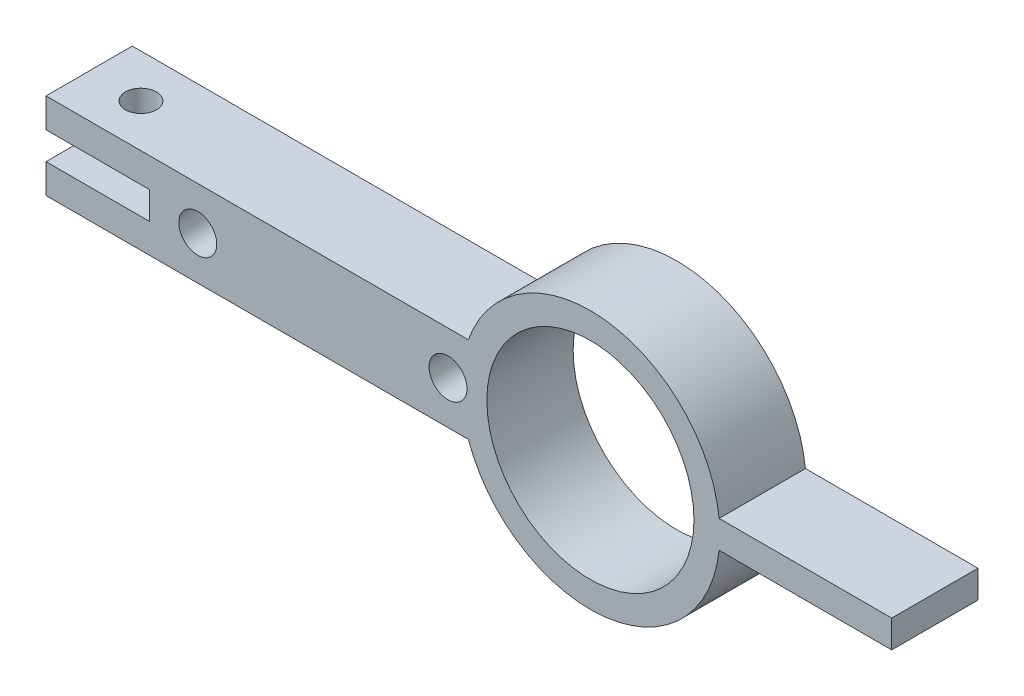
ISO-10303-21;
HEADER;
FILE_DESCRIPTION(('STEP AP214'),'2;1');
FILE_NAME('part.step','',(''),(''),'','','');
FILE_SCHEMA(('AUTOMOTIVE_DESIGN { 1 0 10303 214 1 1 1 1 }'));
ENDSEC;
DATA;
#1=APPLICATION_CONTEXT('core data for automotive mechanical design processes');
#2=APPLICATION_PROTOCOL_DEFINITION('international standard','automotive_design',2000,#1);
#3=PRODUCT_CONTEXT('',#1,'mechanical');
#4=PRODUCT('Part','Part','',(#3));
#5=PRODUCT_RELATED_PRODUCT_CATEGORY('part','',(#4));
#6=PRODUCT_DEFINITION_FORMATION('','',#4);
#7=PRODUCT_DEFINITION_CONTEXT('part definition',#1,'design');
#8=PRODUCT_DEFINITION('design','',#6,#7);
#9=PRODUCT_DEFINITION_SHAPE('','',#8);
#10=(LENGTH_UNIT() NAMED_UNIT(*) SI_UNIT(.MILLI.,.METRE.));
#11=(NAMED_UNIT(*) PLANE_ANGLE_UNIT() SI_UNIT($,.RADIAN.));
#12=(NAMED_UNIT(*) SI_UNIT($,.STERADIAN.) SOLID_ANGLE_UNIT());
#13=UNCERTAINTY_MEASURE_WITH_UNIT(LENGTH_MEASURE(1.E-05),#10,'distance_accuracy_value','');
#14=(GEOMETRIC_REPRESENTATION_CONTEXT(3) GLOBAL_UNCERTAINTY_ASSIGNED_CONTEXT((#13)) GLOBAL_UNIT_ASSIGNED_CONTEXT((#10,
#11,#12)) REPRESENTATION_CONTEXT('',''));
#15=CARTESIAN_POINT('',(0.,0.,0.));
#16=DIRECTION('',(0.,0.,1.));
#17=DIRECTION('',(1.,0.,0.));
#18=AXIS2_PLACEMENT_3D('',#15,#16,#17);
#19=CARTESIAN_POINT('',(-31.5427887249991,2.5,2.5));
#20=DIRECTION('',(1.,0.,0.));
#21=DIRECTION('',(0.,0.,-1.));
#22=AXIS2_PLACEMENT_3D('',#19,#20,#21);
#23=PLANE('',#22);
#24=DIRECTION('',(0.,-1.,0.));
#25=VECTOR('',#24,1.);
#26=CARTESIAN_POINT('',(-31.5427887249991,2.5,-2.5));
#27=LINE('',#26,#25);
#28=CARTESIAN_POINT('',(-31.5427887249991,2.5,-2.5));
#29=VERTEX_POINT('',#28);
#30=CARTESIAN_POINT('',(-31.5427887249991,0.800000000000001,-2.5));
#31=VERTEX_POINT('',#30);
#32=EDGE_CURVE('E154',#29,#31,#27,.T.);
#33=ORIENTED_EDGE('',*,*,#32,.T.);
#34=DIRECTION('',(0.,0.,-1.));
#35=VECTOR('',#34,1.);
#36=CARTESIAN_POINT('',(-31.5427887249991,0.800000000000001,2.5));
#37=LINE('',#36,#35);
#38=CARTESIAN_POINT('',(-31.5427887249991,0.800000000000001,2.5));
#39=VERTEX_POINT('',#38);
#40=EDGE_CURVE('E11',#39,#31,#37,.T.);
#41=ORIENTED_EDGE('',*,*,#40,.F.);
#42=DIRECTION('',(0.,-1.,0.));
#43=VECTOR('',#42,1.);
#44=CARTESIAN_POINT('',(-31.5427887249991,2.5,2.5));
#45=LINE('',#44,#43);
#46=CARTESIAN_POINT('',(-31.5427887249991,2.5,2.5));
#47=VERTEX_POINT('',#46);
#48=EDGE_CURVE('E177',#47,#39,#45,.T.);
#49=ORIENTED_EDGE('',*,*,#48,.F.);
#50=DIRECTION('',(0.,0.,-1.));
#51=VECTOR('',#50,1.);
#52=CARTESIAN_POINT('',(-31.5427887249991,2.5,2.5));
#53=LINE('',#52,#51);
#54=EDGE_CURVE('E150',#47,#29,#53,.T.);
#55=ORIENTED_EDGE('',*,*,#54,.T.);
#56=EDGE_LOOP('',(#33,#41,#49,#55));
#57=FACE_BOUND('',#56,.T.);
#58=ADVANCED_FACE('F34',(#57),#23,.F.);
#59=CARTESIAN_POINT('',(-31.5427887249991,0.800000000000001,2.5));
#60=DIRECTION('',(0.,1.,0.));
#61=DIRECTION('',(0.,0.,1.));
#62=AXIS2_PLACEMENT_3D('',#59,#60,#61);
#63=PLANE('',#62);
#64=CARTESIAN_POINT('',(-28.5427887249991,0.800000000000001,0.));
#65=DIRECTION('',(0.,1.,0.));
#66=DIRECTION('',(0.,0.,1.));
#67=AXIS2_PLACEMENT_3D('',#64,#65,#66);
#68=CIRCLE('',#67,0.900000000000014);
#69=CARTESIAN_POINT('',(-28.5427887249991,0.800000000000001,0.900000000000014));
#70=VERTEX_POINT('',#69);
#71=EDGE_CURVE('E386',#70,#70,#68,.T.);
#72=ORIENTED_EDGE('',*,*,#71,.T.);
#73=EDGE_LOOP('',(#72));
#74=FACE_BOUND('',#73,.T.);
#75=DIRECTION('',(1.,0.,0.));
#76=VECTOR('',#75,1.);
#77=CARTESIAN_POINT('',(-31.5427887249991,0.800000000000001,-2.5));
#78=LINE('',#77,#76);
#79=CARTESIAN_POINT('',(-25.5427887249991,0.800000000000001,-2.5));
#80=VERTEX_POINT('',#79);
#81=EDGE_CURVE('E157',#31,#80,#78,.T.);
#82=ORIENTED_EDGE('',*,*,#81,.T.);
#83=DIRECTION('',(0.,0.,-1.));
#84=VECTOR('',#83,1.);
#85=CARTESIAN_POINT('',(-25.5427887249991,0.800000000000001,2.5));
#86=LINE('',#85,#84);
#87=CARTESIAN_POINT('',(-25.5427887249991,0.800000000000001,2.5));
#88=VERTEX_POINT('',#87);
#89=EDGE_CURVE('E42',#88,#80,#86,.T.);
#90=ORIENTED_EDGE('',*,*,#89,.F.);
#91=DIRECTION('',(1.,0.,0.));
#92=VECTOR('',#91,1.);
#93=CARTESIAN_POINT('',(-31.5427887249991,0.800000000000001,2.5));
#94=LINE('',#93,#92);
#95=EDGE_CURVE('E105',#39,#88,#94,.T.);
#96=ORIENTED_EDGE('',*,*,#95,.F.);
#97=ORIENTED_EDGE('',*,*,#40,.T.);
#98=EDGE_LOOP('',(#82,#90,#96,#97));
#99=FACE_BOUND('',#98,.T.);
#100=ADVANCED_FACE('F260',(#74,#99),#63,.F.);
#101=CARTESIAN_POINT('',(-25.5427887249991,0.800000000000001,2.5));
#102=DIRECTION('',(1.,0.,0.));
#103=DIRECTION('',(0.,0.,-1.));
#104=AXIS2_PLACEMENT_3D('',#101,#102,#103);
#105=PLANE('',#104);
#106=DIRECTION('',(0.,-1.,0.));
#107=VECTOR('',#106,1.);
#108=CARTESIAN_POINT('',(-25.5427887249991,0.800000000000001,-2.5));
#109=LINE('',#108,#107);
#110=CARTESIAN_POINT('',(-25.5427887249991,-0.800000000000001,-2.5));
#111=VERTEX_POINT('',#110);
#112=EDGE_CURVE('E160',#80,#111,#109,.T.);
#113=ORIENTED_EDGE('',*,*,#112,.T.);
#114=DIRECTION('',(0.,0.,-1.));
#115=VECTOR('',#114,1.);
#116=CARTESIAN_POINT('',(-25.5427887249991,-0.800000000000001,2.5));
#117=LINE('',#116,#115);
#118=CARTESIAN_POINT('',(-25.5427887249991,-0.800000000000001,2.5));
#119=VERTEX_POINT('',#118);
#120=EDGE_CURVE('E196',#119,#111,#117,.T.);
#121=ORIENTED_EDGE('',*,*,#120,.F.);
#122=DIRECTION('',(0.,-1.,0.));
#123=VECTOR('',#122,1.);
#124=CARTESIAN_POINT('',(-25.5427887249991,0.800000000000001,2.5));
#125=LINE('',#124,#123);
#126=EDGE_CURVE('E204',#88,#119,#125,.T.);
#127=ORIENTED_EDGE('',*,*,#126,.F.);
#128=ORIENTED_EDGE('',*,*,#89,.T.);
#129=EDGE_LOOP('',(#113,#121,#127,#128));
#130=FACE_BOUND('',#129,.T.);
#131=ADVANCED_FACE('F202',(#130),#105,.F.);
#132=CARTESIAN_POINT('',(-25.5427887249991,-0.800000000000001,2.5));
#133=DIRECTION('',(0.,-1.,0.));
#134=DIRECTION('',(0.,0.,-1.));
#135=AXIS2_PLACEMENT_3D('',#132,#133,#134);
#136=PLANE('',#135);
#137=CARTESIAN_POINT('',(-28.5427887249991,-0.800000000000001,0.));
#138=DIRECTION('',(0.,-1.,0.));
#139=DIRECTION('',(0.,0.,-1.));
#140=AXIS2_PLACEMENT_3D('',#137,#138,#139);
#141=CIRCLE('',#140,0.900000000000014);
#142=CARTESIAN_POINT('',(-28.5427887249991,-0.800000000000001,-0.900000000000014));
#143=VERTEX_POINT('',#142);
#144=EDGE_CURVE('E383',#143,#143,#141,.T.);
#145=ORIENTED_EDGE('',*,*,#144,.T.);
#146=EDGE_LOOP('',(#145));
#147=FACE_BOUND('',#146,.T.);
#148=DIRECTION('',(-1.,0.,0.));
#149=VECTOR('',#148,1.);
#150=CARTESIAN_POINT('',(-25.5427887249991,-0.800000000000001,-2.5));
#151=LINE('',#150,#149);
#152=CARTESIAN_POINT('',(-31.5427887249991,-0.800000000000001,-2.5));
#153=VERTEX_POINT('',#152);
#154=EDGE_CURVE('E162',#111,#153,#151,.T.);
#155=ORIENTED_EDGE('',*,*,#154,.T.);
#156=DIRECTION('',(0.,0.,-1.));
#157=VECTOR('',#156,1.);
#158=CARTESIAN_POINT('',(-31.5427887249991,-0.800000000000001,2.5));
#159=LINE('',#158,#157);
#160=CARTESIAN_POINT('',(-31.5427887249991,-0.800000000000001,2.5));
#161=VERTEX_POINT('',#160);
#162=EDGE_CURVE('E193',#161,#153,#159,.T.);
#163=ORIENTED_EDGE('',*,*,#162,.F.);
#164=DIRECTION('',(-1.,0.,0.));
#165=VECTOR('',#164,1.);
#166=CARTESIAN_POINT('',(-25.5427887249991,-0.800000000000001,2.5));
#167=LINE('',#166,#165);
#168=EDGE_CURVE('E222',#119,#161,#167,.T.);
#169=ORIENTED_EDGE('',*,*,#168,.F.);
#170=ORIENTED_EDGE('',*,*,#120,.T.);
#171=EDGE_LOOP('',(#155,#163,#169,#170));
#172=FACE_BOUND('',#171,.T.);
#173=ADVANCED_FACE('F213',(#147,#172),#136,.F.);
#174=CARTESIAN_POINT('',(-31.5427887249991,-0.800000000000001,2.5));
#175=DIRECTION('',(1.,0.,0.));
#176=DIRECTION('',(0.,0.,-1.));
#177=AXIS2_PLACEMENT_3D('',#174,#175,#176);
#178=PLANE('',#177);
#179=DIRECTION('',(0.,-1.,0.));
#180=VECTOR('',#179,1.);
#181=CARTESIAN_POINT('',(-31.5427887249991,-0.800000000000001,-2.5));
#182=LINE('',#181,#180);
#183=CARTESIAN_POINT('',(-31.5427887249991,-2.5,-2.5));
#184=VERTEX_POINT('',#183);
#185=EDGE_CURVE('E164',#153,#184,#182,.T.);
#186=ORIENTED_EDGE('',*,*,#185,.T.);
#187=DIRECTION('',(0.,0.,-1.));
#188=VECTOR('',#187,1.);
#189=CARTESIAN_POINT('',(-31.5427887249991,-2.5,2.5));
#190=LINE('',#189,#188);
#191=CARTESIAN_POINT('',(-31.5427887249991,-2.5,2.5));
#192=VERTEX_POINT('',#191);
#193=EDGE_CURVE('E190',#192,#184,#190,.T.);
#194=ORIENTED_EDGE('',*,*,#193,.F.);
#195=DIRECTION('',(0.,-1.,0.));
#196=VECTOR('',#195,1.);
#197=CARTESIAN_POINT('',(-31.5427887249991,-0.800000000000001,2.5));
#198=LINE('',#197,#196);
#199=EDGE_CURVE('E219',#161,#192,#198,.T.);
#200=ORIENTED_EDGE('',*,*,#199,.F.);
#201=ORIENTED_EDGE('',*,*,#162,.T.);
#202=EDGE_LOOP('',(#186,#194,#200,#201));
#203=FACE_BOUND('',#202,.T.);
#204=ADVANCED_FACE('F217',(#203),#178,.F.);
#205=CARTESIAN_POINT('',(-31.5427887249991,-2.5,2.5));
#206=DIRECTION('',(0.,1.,0.));
#207=DIRECTION('',(0.,0.,1.));
#208=AXIS2_PLACEMENT_3D('',#205,#206,#207);
#209=PLANE('',#208);
#210=CARTESIAN_POINT('',(-28.5427887249991,-2.5,0.));
#211=DIRECTION('',(0.,1.,0.));
#212=DIRECTION('',(0.,0.,1.));
#213=AXIS2_PLACEMENT_3D('',#210,#211,#212);
#214=CIRCLE('',#213,0.900000000000014);
#215=CARTESIAN_POINT('',(-28.5427887249991,-2.5,0.900000000000014));
#216=VERTEX_POINT('',#215);
#217=EDGE_CURVE('E388',#216,#216,#214,.T.);
#218=ORIENTED_EDGE('',*,*,#217,.T.);
#219=EDGE_LOOP('',(#218));
#220=FACE_BOUND('',#219,.T.);
#221=DIRECTION('',(1.,0.,0.));
#222=VECTOR('',#221,1.);
#223=CARTESIAN_POINT('',(-31.5427887249991,-2.5,-2.5));
#224=LINE('',#223,#222);
#225=CARTESIAN_POINT('',(-7.07106781186548,-2.5,-2.5));
#226=VERTEX_POINT('',#225);
#227=EDGE_CURVE('E166',#184,#226,#224,.T.);
#228=ORIENTED_EDGE('',*,*,#227,.T.);
#229=DIRECTION('',(0.,0.,-1.));
#230=VECTOR('',#229,1.);
#231=CARTESIAN_POINT('',(-7.07106781186548,-2.5,2.5));
#232=LINE('',#231,#230);
#233=CARTESIAN_POINT('',(-7.07106781186548,-2.5,2.5));
#234=VERTEX_POINT('',#233);
#235=EDGE_CURVE('E187',#234,#226,#232,.T.);
#236=ORIENTED_EDGE('',*,*,#235,.F.);
#237=DIRECTION('',(1.,0.,0.));
#238=VECTOR('',#237,1.);
#239=CARTESIAN_POINT('',(-31.5427887249991,-2.5,2.5));
#240=LINE('',#239,#238);
#241=EDGE_CURVE('E221',#192,#234,#240,.T.);
#242=ORIENTED_EDGE('',*,*,#241,.F.);
#243=ORIENTED_EDGE('',*,*,#193,.T.);
#244=EDGE_LOOP('',(#228,#236,#242,#243));
#245=FACE_BOUND('',#244,.T.);
#246=ADVANCED_FACE('F277',(#220,#245),#209,.F.);
#247=CARTESIAN_POINT('',(0.,0.,2.5));
#248=DIRECTION('',(0.,0.,-1.));
#249=DIRECTION('',(-1.,0.,0.));
#250=AXIS2_PLACEMENT_3D('',#247,#248,#249);
#251=CYLINDRICAL_SURFACE('',#250,7.5);
#252=CARTESIAN_POINT('',(0.,0.,-2.5));
#253=DIRECTION('',(0.,0.,1.));
#254=DIRECTION('',(1.,0.,0.));
#255=AXIS2_PLACEMENT_3D('',#252,#253,#254);
#256=CIRCLE('',#255,7.5);
#257=CARTESIAN_POINT('',(7.45721127500086,-0.799999999999999,-2.5));
#258=VERTEX_POINT('',#257);
#259=EDGE_CURVE('E168',#226,#258,#256,.T.);
#260=ORIENTED_EDGE('',*,*,#259,.T.);
#261=DIRECTION('',(0.,0.,-1.));
#262=VECTOR('',#261,1.);
#263=CARTESIAN_POINT('',(7.45721127500086,-0.799999999999999,2.5));
#264=LINE('',#263,#262);
#265=CARTESIAN_POINT('',(7.45721127500086,-0.799999999999999,2.5));
#266=VERTEX_POINT('',#265);
#267=EDGE_CURVE('E184',#266,#258,#264,.T.);
#268=ORIENTED_EDGE('',*,*,#267,.F.);
#269=CARTESIAN_POINT('',(0.,0.,2.5));
#270=DIRECTION('',(0.,0.,1.));
#271=DIRECTION('',(1.,0.,0.));
#272=AXIS2_PLACEMENT_3D('',#269,#270,#271);
#273=CIRCLE('',#272,7.5);
#274=EDGE_CURVE('E224',#234,#266,#273,.T.);
#275=ORIENTED_EDGE('',*,*,#274,.F.);
#276=ORIENTED_EDGE('',*,*,#235,.T.);
#277=EDGE_LOOP('',(#260,#268,#275,#276));
#278=FACE_BOUND('',#277,.T.);
#279=ADVANCED_FACE('F279',(#278),#251,.T.);
#280=CARTESIAN_POINT('',(7.45721127500086,-0.799999999999999,2.5));
#281=DIRECTION('',(0.,1.,0.));
#282=DIRECTION('',(0.,0.,1.));
#283=AXIS2_PLACEMENT_3D('',#280,#281,#282);
#284=PLANE('',#283);
#285=DIRECTION('',(1.,0.,0.));
#286=VECTOR('',#285,1.);
#287=CARTESIAN_POINT('',(7.45721127500086,-0.799999999999999,-2.5));
#288=LINE('',#287,#286);
#289=CARTESIAN_POINT('',(17.4572112750009,-0.799999999999999,-2.5));
#290=VERTEX_POINT('',#289);
#291=EDGE_CURVE('E170',#258,#290,#288,.T.);
#292=ORIENTED_EDGE('',*,*,#291,.T.);
#293=DIRECTION('',(0.,0.,-1.));
#294=VECTOR('',#293,1.);
#295=CARTESIAN_POINT('',(17.4572112750009,-0.799999999999999,2.5));
#296=LINE('',#295,#294);
#297=CARTESIAN_POINT('',(17.4572112750009,-0.799999999999999,2.5));
#298=VERTEX_POINT('',#297);
#299=EDGE_CURVE('E181',#298,#290,#296,.T.);
#300=ORIENTED_EDGE('',*,*,#299,.F.);
#301=DIRECTION('',(1.,0.,0.));
#302=VECTOR('',#301,1.);
#303=CARTESIAN_POINT('',(7.45721127500086,-0.799999999999999,2.5));
#304=LINE('',#303,#302);
#305=EDGE_CURVE('E230',#266,#298,#304,.T.);
#306=ORIENTED_EDGE('',*,*,#305,.F.);
#307=ORIENTED_EDGE('',*,*,#267,.T.);
#308=EDGE_LOOP('',(#292,#300,#306,#307));
#309=FACE_BOUND('',#308,.T.);
#310=ADVANCED_FACE('F236',(#309),#284,.F.);
#311=CARTESIAN_POINT('',(17.4572112750009,0.800000000000001,2.5));
#312=DIRECTION('',(-1.,0.,0.));
#313=DIRECTION('',(0.,-1.,0.));
#314=AXIS2_PLACEMENT_3D('',#311,#312,#313);
#315=PLANE('',#314);
#316=DIRECTION('',(0.,1.,0.));
#317=VECTOR('',#316,1.);
#318=CARTESIAN_POINT('',(17.4572112750009,0.800000000000001,-2.5));
#319=LINE('',#318,#317);
#320=CARTESIAN_POINT('',(17.4572112750009,0.800000000000001,-2.5));
#321=VERTEX_POINT('',#320);
#322=EDGE_CURVE('E172',#290,#321,#319,.T.);
#323=ORIENTED_EDGE('',*,*,#322,.T.);
#324=DIRECTION('',(0.,0.,-1.));
#325=VECTOR('',#324,1.);
#326=CARTESIAN_POINT('',(17.4572112750009,0.800000000000001,2.5));
#327=LINE('',#326,#325);
#328=CARTESIAN_POINT('',(17.4572112750009,0.800000000000001,2.5));
#329=VERTEX_POINT('',#328);
#330=EDGE_CURVE('E145',#329,#321,#327,.T.);
#331=ORIENTED_EDGE('',*,*,#330,.F.);
#332=DIRECTION('',(0.,1.,0.));
#333=VECTOR('',#332,1.);
#334=CARTESIAN_POINT('',(17.4572112750009,0.800000000000001,2.5));
#335=LINE('',#334,#333);
#336=EDGE_CURVE('E136',#298,#329,#335,.T.);
#337=ORIENTED_EDGE('',*,*,#336,.F.);
#338=ORIENTED_EDGE('',*,*,#299,.T.);
#339=EDGE_LOOP('',(#323,#331,#337,#338));
#340=FACE_BOUND('',#339,.T.);
#341=ADVANCED_FACE('F240',(#340),#315,.F.);
#342=CARTESIAN_POINT('',(7.45721127500086,0.8,2.5));
#343=DIRECTION('',(0.,-1.,0.));
#344=DIRECTION('',(1.,0.,0.));
#345=AXIS2_PLACEMENT_3D('',#342,#343,#344);
#346=PLANE('',#345);
#347=DIRECTION('',(-1.,0.,0.));
#348=VECTOR('',#347,1.);
#349=CARTESIAN_POINT('',(7.45721127500086,0.8,-2.5));
#350=LINE('',#349,#348);
#351=CARTESIAN_POINT('',(7.45721127500086,0.8,-2.5));
#352=VERTEX_POINT('',#351);
#353=EDGE_CURVE('E144',#321,#352,#350,.T.);
#354=ORIENTED_EDGE('',*,*,#353,.T.);
#355=DIRECTION('',(0.,0.,-1.));
#356=VECTOR('',#355,1.);
#357=CARTESIAN_POINT('',(7.45721127500086,0.8,2.5));
#358=LINE('',#357,#356);
#359=CARTESIAN_POINT('',(7.45721127500086,0.8,2.5));
#360=VERTEX_POINT('',#359);
#361=EDGE_CURVE('E141',#360,#352,#358,.T.);
#362=ORIENTED_EDGE('',*,*,#361,.F.);
#363=DIRECTION('',(-1.,0.,0.));
#364=VECTOR('',#363,1.);
#365=CARTESIAN_POINT('',(7.45721127500086,0.8,2.5));
#366=LINE('',#365,#364);
#367=EDGE_CURVE('E130',#329,#360,#366,.T.);
#368=ORIENTED_EDGE('',*,*,#367,.F.);
#369=ORIENTED_EDGE('',*,*,#330,.T.);
#370=EDGE_LOOP('',(#354,#362,#368,#369));
#371=FACE_BOUND('',#370,.T.);
#372=ADVANCED_FACE('F142',(#371),#346,.F.);
#373=CARTESIAN_POINT('',(0.,0.,2.5));
#374=DIRECTION('',(0.,0.,-1.));
#375=DIRECTION('',(-1.,0.,0.));
#376=AXIS2_PLACEMENT_3D('',#373,#374,#375);
#377=CYLINDRICAL_SURFACE('',#376,7.5);
#378=CARTESIAN_POINT('',(0.,0.,-2.5));
#379=DIRECTION('',(0.,0.,1.));
#380=DIRECTION('',(1.,0.,0.));
#381=AXIS2_PLACEMENT_3D('',#378,#379,#380);
#382=CIRCLE('',#381,7.5);
#383=CARTESIAN_POINT('',(-7.07106781186548,2.5,-2.5));
#384=VERTEX_POINT('',#383);
#385=EDGE_CURVE('E91',#352,#384,#382,.T.);
#386=ORIENTED_EDGE('',*,*,#385,.T.);
#387=DIRECTION('',(0.,0.,-1.));
#388=VECTOR('',#387,1.);
#389=CARTESIAN_POINT('',(-7.07106781186548,2.5,2.5));
#390=LINE('',#389,#388);
#391=CARTESIAN_POINT('',(-7.07106781186548,2.5,2.5));
#392=VERTEX_POINT('',#391);
#393=EDGE_CURVE('E146',#392,#384,#390,.T.);
#394=ORIENTED_EDGE('',*,*,#393,.F.);
#395=CARTESIAN_POINT('',(0.,0.,2.5));
#396=DIRECTION('',(0.,0.,1.));
#397=DIRECTION('',(1.,0.,0.));
#398=AXIS2_PLACEMENT_3D('',#395,#396,#397);
#399=CIRCLE('',#398,7.5);
#400=EDGE_CURVE('E134',#360,#392,#399,.T.);
#401=ORIENTED_EDGE('',*,*,#400,.F.);
#402=ORIENTED_EDGE('',*,*,#361,.T.);
#403=EDGE_LOOP('',(#386,#394,#401,#402));
#404=FACE_BOUND('',#403,.T.);
#405=ADVANCED_FACE('F148',(#404),#377,.T.);
#406=CARTESIAN_POINT('',(-31.5427887249991,2.5,2.5));
#407=DIRECTION('',(0.,-1.,0.));
#408=DIRECTION('',(0.,0.,-1.));
#409=AXIS2_PLACEMENT_3D('',#406,#407,#408);
#410=PLANE('',#409);
#411=CARTESIAN_POINT('',(-28.5427887249991,2.5,0.));
#412=DIRECTION('',(0.,1.,0.));
#413=DIRECTION('',(0.,0.,1.));
#414=AXIS2_PLACEMENT_3D('',#411,#412,#413);
#415=CIRCLE('',#414,0.900000000000015);
#416=CARTESIAN_POINT('',(-28.5427887249991,2.5,0.900000000000015));
#417=VERTEX_POINT('',#416);
#418=EDGE_CURVE('E373',#417,#417,#415,.T.);
#419=ORIENTED_EDGE('',*,*,#418,.F.);
#420=EDGE_LOOP('',(#419));
#421=FACE_BOUND('',#420,.T.);
#422=DIRECTION('',(-1.,0.,0.));
#423=VECTOR('',#422,1.);
#424=CARTESIAN_POINT('',(-31.5427887249991,2.5,-2.5));
#425=LINE('',#424,#423);
#426=EDGE_CURVE('E97',#384,#29,#425,.T.);
#427=ORIENTED_EDGE('',*,*,#426,.T.);
#428=ORIENTED_EDGE('',*,*,#54,.F.);
#429=DIRECTION('',(-1.,0.,0.));
#430=VECTOR('',#429,1.);
#431=CARTESIAN_POINT('',(-31.5427887249991,2.5,2.5));
#432=LINE('',#431,#430);
#433=EDGE_CURVE('E50',#392,#47,#432,.T.);
#434=ORIENTED_EDGE('',*,*,#433,.F.);
#435=ORIENTED_EDGE('',*,*,#393,.T.);
#436=EDGE_LOOP('',(#427,#428,#434,#435));
#437=FACE_BOUND('',#436,.T.);
#438=ADVANCED_FACE('F244',(#421,#437),#410,.F.);
#439=CARTESIAN_POINT('',(0.,0.,2.5));
#440=DIRECTION('',(0.,0.,1.));
#441=DIRECTION('',(1.,0.,0.));
#442=AXIS2_PLACEMENT_3D('',#439,#440,#441);
#443=PLANE('',#442);
#444=CARTESIAN_POINT('',(-8.25000000000001,0.,2.5));
#445=DIRECTION('',(0.,0.,1.));
#446=DIRECTION('',(1.,0.,0.));
#447=AXIS2_PLACEMENT_3D('',#444,#445,#446);
#448=CIRCLE('',#447,1.1);
#449=CARTESIAN_POINT('',(-7.15000000000001,0.,2.5));
#450=VERTEX_POINT('',#449);
#451=EDGE_CURVE('E367',#450,#450,#448,.T.);
#452=ORIENTED_EDGE('',*,*,#451,.F.);
#453=EDGE_LOOP('',(#452));
#454=FACE_BOUND('',#453,.T.);
#455=CARTESIAN_POINT('',(-22.75,0.,2.5));
#456=DIRECTION('',(0.,0.,1.));
#457=DIRECTION('',(1.,0.,0.));
#458=AXIS2_PLACEMENT_3D('',#455,#456,#457);
#459=CIRCLE('',#458,1.1);
#460=CARTESIAN_POINT('',(-21.65,0.,2.5));
#461=VERTEX_POINT('',#460);
#462=EDGE_CURVE('E371',#461,#461,#459,.T.);
#463=ORIENTED_EDGE('',*,*,#462,.F.);
#464=EDGE_LOOP('',(#463));
#465=FACE_BOUND('',#464,.T.);
#466=CARTESIAN_POINT('',(0.,0.,2.5));
#467=DIRECTION('',(0.,0.,1.));
#468=DIRECTION('',(1.,0.,0.));
#469=AXIS2_PLACEMENT_3D('',#466,#467,#468);
#470=CIRCLE('',#469,6.);
#471=CARTESIAN_POINT('',(6.,0.,2.5));
#472=VERTEX_POINT('',#471);
#473=EDGE_CURVE('E391',#472,#472,#470,.T.);
#474=ORIENTED_EDGE('',*,*,#473,.F.);
#475=EDGE_LOOP('',(#474));
#476=FACE_BOUND('',#475,.T.);
#477=ORIENTED_EDGE('',*,*,#48,.T.);
#478=ORIENTED_EDGE('',*,*,#95,.T.);
#479=ORIENTED_EDGE('',*,*,#126,.T.);
#480=ORIENTED_EDGE('',*,*,#168,.T.);
#481=ORIENTED_EDGE('',*,*,#199,.T.);
#482=ORIENTED_EDGE('',*,*,#241,.T.);
#483=ORIENTED_EDGE('',*,*,#274,.T.);
#484=ORIENTED_EDGE('',*,*,#305,.T.);
#485=ORIENTED_EDGE('',*,*,#336,.T.);
#486=ORIENTED_EDGE('',*,*,#367,.T.);
#487=ORIENTED_EDGE('',*,*,#400,.T.);
#488=ORIENTED_EDGE('',*,*,#433,.T.);
#489=EDGE_LOOP('',(#477,#478,#479,#480,#481,#482,#483,#484,#485,#486,#487,#488));
#490=FACE_BOUND('',#489,.T.);
#491=ADVANCED_FACE('F132',(#454,#465,#476,#490),#443,.T.);
#492=CARTESIAN_POINT('',(0.,0.,-2.5));
#493=DIRECTION('',(0.,0.,1.));
#494=DIRECTION('',(1.,0.,0.));
#495=AXIS2_PLACEMENT_3D('',#492,#493,#494);
#496=PLANE('',#495);
#497=CARTESIAN_POINT('',(-8.25000000000001,0.,-2.5));
#498=DIRECTION('',(0.,0.,1.));
#499=DIRECTION('',(1.,0.,0.));
#500=AXIS2_PLACEMENT_3D('',#497,#498,#499);
#501=CIRCLE('',#500,1.1);
#502=CARTESIAN_POINT('',(-7.15000000000001,0.,-2.5));
#503=VERTEX_POINT('',#502);
#504=EDGE_CURVE('E370',#503,#503,#501,.T.);
#505=ORIENTED_EDGE('',*,*,#504,.T.);
#506=EDGE_LOOP('',(#505));
#507=FACE_BOUND('',#506,.T.);
#508=CARTESIAN_POINT('',(-22.75,0.,-2.5));
#509=DIRECTION('',(0.,0.,1.));
#510=DIRECTION('',(1.,0.,0.));
#511=AXIS2_PLACEMENT_3D('',#508,#509,#510);
#512=CIRCLE('',#511,1.1);
#513=CARTESIAN_POINT('',(-21.65,0.,-2.5));
#514=VERTEX_POINT('',#513);
#515=EDGE_CURVE('E376',#514,#514,#512,.T.);
#516=ORIENTED_EDGE('',*,*,#515,.T.);
#517=EDGE_LOOP('',(#516));
#518=FACE_BOUND('',#517,.T.);
#519=CARTESIAN_POINT('',(0.,0.,-2.5));
#520=DIRECTION('',(0.,0.,1.));
#521=DIRECTION('',(1.,0.,0.));
#522=AXIS2_PLACEMENT_3D('',#519,#520,#521);
#523=CIRCLE('',#522,6.);
#524=CARTESIAN_POINT('',(6.,0.,-2.5));
#525=VERTEX_POINT('',#524);
#526=EDGE_CURVE('E158',#525,#525,#523,.T.);
#527=ORIENTED_EDGE('',*,*,#526,.T.);
#528=EDGE_LOOP('',(#527));
#529=FACE_BOUND('',#528,.T.);
#530=ORIENTED_EDGE('',*,*,#32,.F.);
#531=ORIENTED_EDGE('',*,*,#426,.F.);
#532=ORIENTED_EDGE('',*,*,#385,.F.);
#533=ORIENTED_EDGE('',*,*,#353,.F.);
#534=ORIENTED_EDGE('',*,*,#322,.F.);
#535=ORIENTED_EDGE('',*,*,#291,.F.);
#536=ORIENTED_EDGE('',*,*,#259,.F.);
#537=ORIENTED_EDGE('',*,*,#227,.F.);
#538=ORIENTED_EDGE('',*,*,#185,.F.);
#539=ORIENTED_EDGE('',*,*,#154,.F.);
#540=ORIENTED_EDGE('',*,*,#112,.F.);
#541=ORIENTED_EDGE('',*,*,#81,.F.);
#542=EDGE_LOOP('',(#530,#531,#532,#533,#534,#535,#536,#537,#538,#539,#540,#541));
#543=FACE_BOUND('',#542,.T.);
#544=ADVANCED_FACE('F208',(#507,#518,#529,#543),#496,.F.);
#545=CARTESIAN_POINT('',(0.,0.,2.5));
#546=DIRECTION('',(0.,0.,1.));
#547=DIRECTION('',(1.,0.,0.));
#548=AXIS2_PLACEMENT_3D('',#545,#546,#547);
#549=CYLINDRICAL_SURFACE('',#548,6.);
#550=ORIENTED_EDGE('',*,*,#526,.F.);
#551=EDGE_LOOP('',(#550));
#552=FACE_BOUND('',#551,.T.);
#553=ORIENTED_EDGE('',*,*,#473,.T.);
#554=EDGE_LOOP('',(#553));
#555=FACE_BOUND('',#554,.T.);
#556=ADVANCED_FACE('F315',(#552,#555),#549,.F.);
#557=CARTESIAN_POINT('',(-28.5427887249991,2.5,0.));
#558=DIRECTION('',(0.,1.,0.));
#559=DIRECTION('',(0.,0.,1.));
#560=AXIS2_PLACEMENT_3D('',#557,#558,#559);
#561=CYLINDRICAL_SURFACE('',#560,0.900000000000014);
#562=ORIENTED_EDGE('',*,*,#418,.T.);
#563=EDGE_LOOP('',(#562));
#564=FACE_BOUND('',#563,.T.);
#565=ORIENTED_EDGE('',*,*,#71,.F.);
#566=EDGE_LOOP('',(#565));
#567=FACE_BOUND('',#566,.T.);
#568=ADVANCED_FACE('F324',(#564,#567),#561,.F.);
#569=ORIENTED_EDGE('',*,*,#144,.F.);
#570=EDGE_LOOP('',(#569));
#571=FACE_BOUND('',#570,.T.);
#572=ORIENTED_EDGE('',*,*,#217,.F.);
#573=EDGE_LOOP('',(#572));
#574=FACE_BOUND('',#573,.T.);
#575=ADVANCED_FACE('F330',(#571,#574),#561,.F.);
#576=CARTESIAN_POINT('',(-22.75,0.,2.5));
#577=DIRECTION('',(0.,0.,-1.));
#578=DIRECTION('',(-1.,0.,0.));
#579=AXIS2_PLACEMENT_3D('',#576,#577,#578);
#580=CYLINDRICAL_SURFACE('',#579,1.1);
#581=ORIENTED_EDGE('',*,*,#462,.T.);
#582=EDGE_LOOP('',(#581));
#583=FACE_BOUND('',#582,.T.);
#584=ORIENTED_EDGE('',*,*,#515,.F.);
#585=EDGE_LOOP('',(#584));
#586=FACE_BOUND('',#585,.T.);
#587=ADVANCED_FACE('F337',(#583,#586),#580,.F.);
#588=CARTESIAN_POINT('',(-8.25000000000001,0.,2.5));
#589=DIRECTION('',(0.,0.,-1.));
#590=DIRECTION('',(-1.,0.,0.));
#591=AXIS2_PLACEMENT_3D('',#588,#589,#590);
#592=CYLINDRICAL_SURFACE('',#591,1.1);
#593=ORIENTED_EDGE('',*,*,#451,.T.);
#594=EDGE_LOOP('',(#593));
#595=FACE_BOUND('',#594,.T.);
#596=ORIENTED_EDGE('',*,*,#504,.F.);
#597=EDGE_LOOP('',(#596));
#598=FACE_BOUND('',#597,.T.);
#599=ADVANCED_FACE('F343',(#595,#598),#592,.F.);
#600=CLOSED_SHELL('',(#58,#100,#131,#173,#204,#246,#279,#310,#341,#372,#405,#438,#491,#544,#556,
#568,#575,#587,#599));
#601=MANIFOLD_SOLID_BREP('B2',#600);
#602=ADVANCED_BREP_SHAPE_REPRESENTATION('',(#18,#601),#14);
#603=SHAPE_DEFINITION_REPRESENTATION(#9,#602);
ENDSEC;
END-ISO-10303-21;
